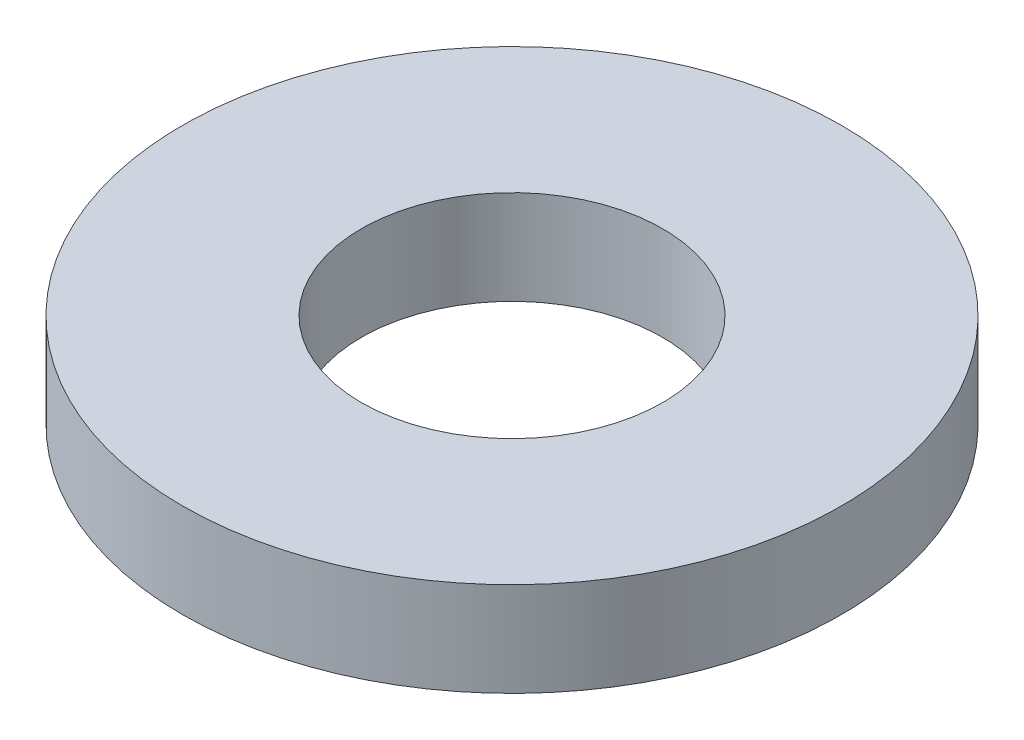
ISO-10303-21;
HEADER;
FILE_DESCRIPTION(('STEP AP214'),'2;1');
FILE_NAME('part.step','',(''),(''),'','','');
FILE_SCHEMA(('AUTOMOTIVE_DESIGN { 1 0 10303 214 1 1 1 1 }'));
ENDSEC;
DATA;
#1=APPLICATION_CONTEXT('core data for automotive mechanical design processes');
#2=APPLICATION_PROTOCOL_DEFINITION('international standard','automotive_design',2000,#1);
#3=PRODUCT_CONTEXT('',#1,'mechanical');
#4=PRODUCT('Part','Part','',(#3));
#5=PRODUCT_RELATED_PRODUCT_CATEGORY('part','',(#4));
#6=PRODUCT_DEFINITION_FORMATION('','',#4);
#7=PRODUCT_DEFINITION_CONTEXT('part definition',#1,'design');
#8=PRODUCT_DEFINITION('design','',#6,#7);
#9=PRODUCT_DEFINITION_SHAPE('','',#8);
#10=(LENGTH_UNIT() NAMED_UNIT(*) SI_UNIT(.MILLI.,.METRE.));
#11=(NAMED_UNIT(*) PLANE_ANGLE_UNIT() SI_UNIT($,.RADIAN.));
#12=(NAMED_UNIT(*) SI_UNIT($,.STERADIAN.) SOLID_ANGLE_UNIT());
#13=UNCERTAINTY_MEASURE_WITH_UNIT(LENGTH_MEASURE(1.E-05),#10,'distance_accuracy_value','');
#14=(GEOMETRIC_REPRESENTATION_CONTEXT(3) GLOBAL_UNCERTAINTY_ASSIGNED_CONTEXT((#13)) GLOBAL_UNIT_ASSIGNED_CONTEXT((#10,
#11,#12)) REPRESENTATION_CONTEXT('',''));
#15=CARTESIAN_POINT('',(0.,0.,0.));
#16=DIRECTION('',(0.,0.,1.));
#17=DIRECTION('',(1.,0.,0.));
#18=AXIS2_PLACEMENT_3D('',#15,#16,#17);
#19=CARTESIAN_POINT('',(0.,5.,0.));
#20=DIRECTION('',(0.,1.,0.));
#21=DIRECTION('',(0.,0.,1.));
#22=AXIS2_PLACEMENT_3D('',#19,#20,#21);
#23=PLANE('',#22);
#24=CARTESIAN_POINT('',(0.,5.,0.));
#25=DIRECTION('',(0.,1.,0.));
#26=DIRECTION('',(0.,0.,1.));
#27=AXIS2_PLACEMENT_3D('',#24,#25,#26);
#28=CIRCLE('',#27,17.5);
#29=CARTESIAN_POINT('',(0.,5.,17.5));
#30=VERTEX_POINT('',#29);
#31=EDGE_CURVE('E10',#30,#30,#28,.T.);
#32=ORIENTED_EDGE('',*,*,#31,.T.);
#33=EDGE_LOOP('',(#32));
#34=FACE_BOUND('',#33,.T.);
#35=CARTESIAN_POINT('',(0.,5.,0.));
#36=DIRECTION('',(0.,1.,0.));
#37=DIRECTION('',(0.,0.,1.));
#38=AXIS2_PLACEMENT_3D('',#35,#36,#37);
#39=CIRCLE('',#38,8.);
#40=CARTESIAN_POINT('',(0.,5.,8.));
#41=VERTEX_POINT('',#40);
#42=EDGE_CURVE('E50',#41,#41,#39,.T.);
#43=ORIENTED_EDGE('',*,*,#42,.F.);
#44=EDGE_LOOP('',(#43));
#45=FACE_BOUND('',#44,.T.);
#46=ADVANCED_FACE('F36',(#34,#45),#23,.T.);
#47=CARTESIAN_POINT('',(0.,0.,0.));
#48=DIRECTION('',(0.,1.,0.));
#49=DIRECTION('',(0.,0.,1.));
#50=AXIS2_PLACEMENT_3D('',#47,#48,#49);
#51=PLANE('',#50);
#52=CARTESIAN_POINT('',(0.,0.,0.));
#53=DIRECTION('',(0.,1.,0.));
#54=DIRECTION('',(0.,0.,1.));
#55=AXIS2_PLACEMENT_3D('',#52,#53,#54);
#56=CIRCLE('',#55,17.5);
#57=CARTESIAN_POINT('',(0.,0.,17.5));
#58=VERTEX_POINT('',#57);
#59=EDGE_CURVE('E40',#58,#58,#56,.T.);
#60=ORIENTED_EDGE('',*,*,#59,.F.);
#61=EDGE_LOOP('',(#60));
#62=FACE_BOUND('',#61,.T.);
#63=CARTESIAN_POINT('',(0.,0.,0.));
#64=DIRECTION('',(0.,1.,0.));
#65=DIRECTION('',(0.,0.,1.));
#66=AXIS2_PLACEMENT_3D('',#63,#64,#65);
#67=CIRCLE('',#66,8.);
#68=CARTESIAN_POINT('',(0.,0.,8.));
#69=VERTEX_POINT('',#68);
#70=EDGE_CURVE('E52',#69,#69,#67,.T.);
#71=ORIENTED_EDGE('',*,*,#70,.T.);
#72=EDGE_LOOP('',(#71));
#73=FACE_BOUND('',#72,.T.);
#74=ADVANCED_FACE('F65',(#62,#73),#51,.F.);
#75=CARTESIAN_POINT('',(0.,5.,0.));
#76=DIRECTION('',(0.,-1.,0.));
#77=DIRECTION('',(0.,0.,-1.));
#78=AXIS2_PLACEMENT_3D('',#75,#76,#77);
#79=CYLINDRICAL_SURFACE('',#78,17.5);
#80=ORIENTED_EDGE('',*,*,#31,.F.);
#81=EDGE_LOOP('',(#80));
#82=FACE_BOUND('',#81,.T.);
#83=ORIENTED_EDGE('',*,*,#59,.T.);
#84=EDGE_LOOP('',(#83));
#85=FACE_BOUND('',#84,.T.);
#86=ADVANCED_FACE('F38',(#82,#85),#79,.T.);
#87=CARTESIAN_POINT('',(0.,5.,0.));
#88=DIRECTION('',(0.,-1.,0.));
#89=DIRECTION('',(0.,0.,-1.));
#90=AXIS2_PLACEMENT_3D('',#87,#88,#89);
#91=CYLINDRICAL_SURFACE('',#90,8.);
#92=ORIENTED_EDGE('',*,*,#42,.T.);
#93=EDGE_LOOP('',(#92));
#94=FACE_BOUND('',#93,.T.);
#95=ORIENTED_EDGE('',*,*,#70,.F.);
#96=EDGE_LOOP('',(#95));
#97=FACE_BOUND('',#96,.T.);
#98=ADVANCED_FACE('F61',(#94,#97),#91,.F.);
#99=CLOSED_SHELL('',(#46,#74,#86,#98));
#100=MANIFOLD_SOLID_BREP('B2',#99);
#101=ADVANCED_BREP_SHAPE_REPRESENTATION('',(#18,#100),#14);
#102=SHAPE_DEFINITION_REPRESENTATION(#9,#101);
ENDSEC;
END-ISO-10303-21;
